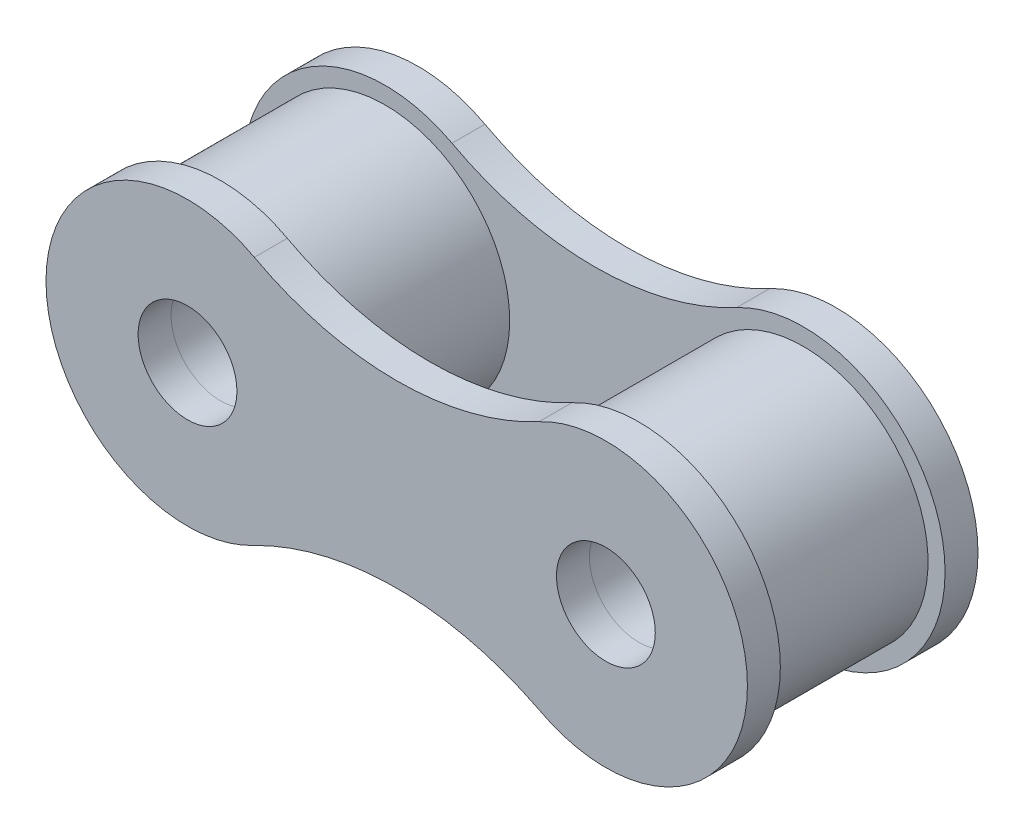
ISO-10303-21;
HEADER;
FILE_DESCRIPTION(('STEP AP214'),'2;1');
FILE_NAME('part.step','',(''),(''),'','','');
FILE_SCHEMA(('AUTOMOTIVE_DESIGN { 1 0 10303 214 1 1 1 1 }'));
ENDSEC;
DATA;
#1=APPLICATION_CONTEXT('core data for automotive mechanical design processes');
#2=APPLICATION_PROTOCOL_DEFINITION('international standard','automotive_design',2000,#1);
#3=PRODUCT_CONTEXT('',#1,'mechanical');
#4=PRODUCT('Part','Part','',(#3));
#5=PRODUCT_RELATED_PRODUCT_CATEGORY('part','',(#4));
#6=PRODUCT_DEFINITION_FORMATION('','',#4);
#7=PRODUCT_DEFINITION_CONTEXT('part definition',#1,'design');
#8=PRODUCT_DEFINITION('design','',#6,#7);
#9=PRODUCT_DEFINITION_SHAPE('','',#8);
#10=(LENGTH_UNIT() NAMED_UNIT(*) SI_UNIT(.MILLI.,.METRE.));
#11=(NAMED_UNIT(*) PLANE_ANGLE_UNIT() SI_UNIT($,.RADIAN.));
#12=(NAMED_UNIT(*) SI_UNIT($,.STERADIAN.) SOLID_ANGLE_UNIT());
#13=UNCERTAINTY_MEASURE_WITH_UNIT(LENGTH_MEASURE(1.E-05),#10,'distance_accuracy_value','');
#14=(GEOMETRIC_REPRESENTATION_CONTEXT(3) GLOBAL_UNCERTAINTY_ASSIGNED_CONTEXT((#13)) GLOBAL_UNIT_ASSIGNED_CONTEXT((#10,
#11,#12)) REPRESENTATION_CONTEXT('',''));
#15=CARTESIAN_POINT('',(0.,0.,0.));
#16=DIRECTION('',(0.,0.,1.));
#17=DIRECTION('',(1.,0.,0.));
#18=AXIS2_PLACEMENT_3D('',#15,#16,#17);
#19=CARTESIAN_POINT('',(3.175,5.92634311386175,-2.5));
#20=DIRECTION('',(0.,0.,1.));
#21=DIRECTION('',(1.,0.,0.));
#22=AXIS2_PLACEMENT_3D('',#19,#20,#21);
#23=PLANE('',#22);
#24=CARTESIAN_POINT('',(6.35,0.,-2.5));
#25=DIRECTION('',(0.,0.,1.));
#26=DIRECTION('',(1.,0.,0.));
#27=AXIS2_PLACEMENT_3D('',#24,#25,#26);
#28=CIRCLE('',#27,1.5);
#29=CARTESIAN_POINT('',(7.85,0.,-2.5));
#30=VERTEX_POINT('',#29);
#31=EDGE_CURVE('E170',#30,#30,#28,.T.);
#32=ORIENTED_EDGE('',*,*,#31,.F.);
#33=EDGE_LOOP('',(#32));
#34=FACE_BOUND('',#33,.T.);
#35=CARTESIAN_POINT('',(6.35,0.,-2.5));
#36=DIRECTION('',(0.,0.,1.));
#37=DIRECTION('',(1.,0.,0.));
#38=AXIS2_PLACEMENT_3D('',#35,#36,#37);
#39=CIRCLE('',#38,1.51190476190476);
#40=CARTESIAN_POINT('',(7.86190476190476,0.,-2.5));
#41=VERTEX_POINT('',#40);
#42=EDGE_CURVE('E11',#41,#41,#39,.F.);
#43=ORIENTED_EDGE('',*,*,#42,.F.);
#44=EDGE_LOOP('',(#43));
#45=FACE_BOUND('',#44,.T.);
#46=ADVANCED_FACE('F34',(#34,#45),#23,.T.);
#47=CARTESIAN_POINT('',(-6.35,0.,2.5));
#48=DIRECTION('',(0.,0.,-1.));
#49=DIRECTION('',(-1.,0.,0.));
#50=AXIS2_PLACEMENT_3D('',#47,#48,#49);
#51=CYLINDRICAL_SURFACE('',#50,3.77976190476191);
#52=CARTESIAN_POINT('',(-6.35,0.,2.5));
#53=DIRECTION('',(0.,0.,1.));
#54=DIRECTION('',(1.,0.,0.));
#55=AXIS2_PLACEMENT_3D('',#52,#53,#54);
#56=CIRCLE('',#55,3.77976190476191);
#57=CARTESIAN_POINT('',(-2.57023809523809,0.,2.5));
#58=VERTEX_POINT('',#57);
#59=EDGE_CURVE('E43',#58,#58,#56,.T.);
#60=ORIENTED_EDGE('',*,*,#59,.F.);
#61=EDGE_LOOP('',(#60));
#62=FACE_BOUND('',#61,.T.);
#63=CARTESIAN_POINT('',(-6.35,0.,-2.5));
#64=DIRECTION('',(0.,0.,1.));
#65=DIRECTION('',(1.,0.,0.));
#66=AXIS2_PLACEMENT_3D('',#63,#64,#65);
#67=CIRCLE('',#66,3.77976190476191);
#68=CARTESIAN_POINT('',(-2.57023809523809,0.,-2.5));
#69=VERTEX_POINT('',#68);
#70=EDGE_CURVE('E198',#69,#69,#67,.T.);
#71=ORIENTED_EDGE('',*,*,#70,.T.);
#72=EDGE_LOOP('',(#71));
#73=FACE_BOUND('',#72,.T.);
#74=ADVANCED_FACE('F36',(#62,#73),#51,.T.);
#75=CARTESIAN_POINT('',(-6.35,0.,2.5));
#76=DIRECTION('',(0.,0.,-1.));
#77=DIRECTION('',(-1.,0.,0.));
#78=AXIS2_PLACEMENT_3D('',#75,#76,#77);
#79=CYLINDRICAL_SURFACE('',#78,1.51190476190476);
#80=CARTESIAN_POINT('',(-6.35,0.,2.5));
#81=DIRECTION('',(0.,0.,1.));
#82=DIRECTION('',(1.,0.,0.));
#83=AXIS2_PLACEMENT_3D('',#80,#81,#82);
#84=CIRCLE('',#83,1.51190476190476);
#85=CARTESIAN_POINT('',(-4.83809523809524,0.,2.5));
#86=VERTEX_POINT('',#85);
#87=EDGE_CURVE('E159',#86,#86,#84,.T.);
#88=ORIENTED_EDGE('',*,*,#87,.T.);
#89=EDGE_LOOP('',(#88));
#90=FACE_BOUND('',#89,.T.);
#91=CARTESIAN_POINT('',(-6.35,0.,-2.5));
#92=DIRECTION('',(0.,0.,1.));
#93=DIRECTION('',(1.,0.,0.));
#94=AXIS2_PLACEMENT_3D('',#91,#92,#93);
#95=CIRCLE('',#94,1.51190476190476);
#96=CARTESIAN_POINT('',(-4.83809523809524,0.,-2.5));
#97=VERTEX_POINT('',#96);
#98=EDGE_CURVE('E205',#97,#97,#95,.T.);
#99=ORIENTED_EDGE('',*,*,#98,.F.);
#100=EDGE_LOOP('',(#99));
#101=FACE_BOUND('',#100,.T.);
#102=ADVANCED_FACE('F242',(#90,#101),#79,.F.);
#103=CARTESIAN_POINT('',(-6.35,0.,-2.5));
#104=DIRECTION('',(0.,0.,1.));
#105=DIRECTION('',(1.,0.,0.));
#106=AXIS2_PLACEMENT_3D('',#103,#104,#105);
#107=CIRCLE('',#106,1.5);
#108=CARTESIAN_POINT('',(-4.85,0.,-2.5));
#109=VERTEX_POINT('',#108);
#110=EDGE_CURVE('E163',#109,#109,#107,.T.);
#111=ORIENTED_EDGE('',*,*,#110,.F.);
#112=EDGE_LOOP('',(#111));
#113=FACE_BOUND('',#112,.T.);
#114=ORIENTED_EDGE('',*,*,#98,.T.);
#115=EDGE_LOOP('',(#114));
#116=FACE_BOUND('',#115,.T.);
#117=ADVANCED_FACE('F220',(#113,#116),#23,.T.);
#118=CARTESIAN_POINT('',(0.,11.8526862277235,-3.5));
#119=DIRECTION('',(0.,0.,1.));
#120=DIRECTION('',(1.,0.,0.));
#121=AXIS2_PLACEMENT_3D('',#118,#119,#120);
#122=CYLINDRICAL_SURFACE('',#121,9.15020153115917);
#123=CARTESIAN_POINT('',(0.,11.8526862277235,-2.5));
#124=DIRECTION('',(0.,0.,-1.));
#125=DIRECTION('',(1.,0.,0.));
#126=AXIS2_PLACEMENT_3D('',#123,#124,#125);
#127=CIRCLE('',#126,9.15020153115917);
#128=CARTESIAN_POINT('',(4.32110438729198,3.78706505295007,-2.5));
#129=VERTEX_POINT('',#128);
#130=CARTESIAN_POINT('',(-4.32110438729198,3.78706505295008,-2.5));
#131=VERTEX_POINT('',#130);
#132=EDGE_CURVE('E176',#129,#131,#127,.T.);
#133=ORIENTED_EDGE('',*,*,#132,.F.);
#134=DIRECTION('',(0.,0.,1.));
#135=VECTOR('',#134,1.);
#136=CARTESIAN_POINT('',(4.32110438729198,3.78706505295007,-3.5));
#137=LINE('',#136,#135);
#138=CARTESIAN_POINT('',(4.32110438729198,3.78706505295007,-3.5));
#139=VERTEX_POINT('',#138);
#140=EDGE_CURVE('E51',#139,#129,#137,.T.);
#141=ORIENTED_EDGE('',*,*,#140,.F.);
#142=CARTESIAN_POINT('',(0.,11.8526862277235,-3.5));
#143=DIRECTION('',(0.,0.,-1.));
#144=DIRECTION('',(1.,0.,0.));
#145=AXIS2_PLACEMENT_3D('',#142,#143,#144);
#146=CIRCLE('',#145,9.15020153115917);
#147=CARTESIAN_POINT('',(-4.32110438729198,3.78706505295008,-3.5));
#148=VERTEX_POINT('',#147);
#149=EDGE_CURVE('E179',#139,#148,#146,.T.);
#150=ORIENTED_EDGE('',*,*,#149,.T.);
#151=DIRECTION('',(0.,0.,1.));
#152=VECTOR('',#151,1.);
#153=CARTESIAN_POINT('',(-4.32110438729198,3.78706505295008,-3.5));
#154=LINE('',#153,#152);
#155=EDGE_CURVE('E80',#148,#131,#154,.T.);
#156=ORIENTED_EDGE('',*,*,#155,.T.);
#157=EDGE_LOOP('',(#133,#141,#150,#156));
#158=FACE_BOUND('',#157,.T.);
#159=ADVANCED_FACE('F221',(#158),#122,.F.);
#160=CARTESIAN_POINT('',(6.35,0.,-3.5));
#161=DIRECTION('',(0.,0.,1.));
#162=DIRECTION('',(1.,0.,0.));
#163=AXIS2_PLACEMENT_3D('',#160,#161,#162);
#164=CYLINDRICAL_SURFACE('',#163,4.2963099425602);
#165=CARTESIAN_POINT('',(6.35,0.,-2.5));
#166=DIRECTION('',(0.,0.,1.));
#167=DIRECTION('',(-1.,0.,0.));
#168=AXIS2_PLACEMENT_3D('',#165,#166,#167);
#169=CIRCLE('',#168,4.2963099425602);
#170=CARTESIAN_POINT('',(4.32110438729198,-3.78706505295008,-2.5));
#171=VERTEX_POINT('',#170);
#172=EDGE_CURVE('E182',#171,#129,#169,.T.);
#173=ORIENTED_EDGE('',*,*,#172,.F.);
#174=DIRECTION('',(0.,0.,1.));
#175=VECTOR('',#174,1.);
#176=CARTESIAN_POINT('',(4.32110438729198,-3.78706505295008,-3.5));
#177=LINE('',#176,#175);
#178=CARTESIAN_POINT('',(4.32110438729198,-3.78706505295008,-3.5));
#179=VERTEX_POINT('',#178);
#180=EDGE_CURVE('E69',#179,#171,#177,.T.);
#181=ORIENTED_EDGE('',*,*,#180,.F.);
#182=CARTESIAN_POINT('',(6.35,0.,-3.5));
#183=DIRECTION('',(0.,0.,1.));
#184=DIRECTION('',(-1.,0.,0.));
#185=AXIS2_PLACEMENT_3D('',#182,#183,#184);
#186=CIRCLE('',#185,4.2963099425602);
#187=EDGE_CURVE('E186',#179,#139,#186,.T.);
#188=ORIENTED_EDGE('',*,*,#187,.T.);
#189=ORIENTED_EDGE('',*,*,#140,.T.);
#190=EDGE_LOOP('',(#173,#181,#188,#189));
#191=FACE_BOUND('',#190,.T.);
#192=ADVANCED_FACE('F225',(#191),#164,.T.);
#193=CARTESIAN_POINT('',(0.,-12.2708333333333,-3.5));
#194=DIRECTION('',(0.,0.,1.));
#195=DIRECTION('',(1.,0.,0.));
#196=AXIS2_PLACEMENT_3D('',#193,#194,#195);
#197=CYLINDRICAL_SURFACE('',#196,9.52083333333333);
#198=CARTESIAN_POINT('',(0.,-12.2708333333333,-2.5));
#199=DIRECTION('',(0.,0.,-1.));
#200=DIRECTION('',(-1.,0.,0.));
#201=AXIS2_PLACEMENT_3D('',#198,#199,#200);
#202=CIRCLE('',#201,9.52083333333333);
#203=CARTESIAN_POINT('',(-4.32110438729198,-3.78706505295008,-2.5));
#204=VERTEX_POINT('',#203);
#205=EDGE_CURVE('E193',#204,#171,#202,.T.);
#206=ORIENTED_EDGE('',*,*,#205,.F.);
#207=DIRECTION('',(0.,0.,1.));
#208=VECTOR('',#207,1.);
#209=CARTESIAN_POINT('',(-4.32110438729198,-3.78706505295008,-3.5));
#210=LINE('',#209,#208);
#211=CARTESIAN_POINT('',(-4.32110438729198,-3.78706505295008,-3.5));
#212=VERTEX_POINT('',#211);
#213=EDGE_CURVE('E200',#212,#204,#210,.T.);
#214=ORIENTED_EDGE('',*,*,#213,.F.);
#215=CARTESIAN_POINT('',(0.,-12.2708333333333,-3.5));
#216=DIRECTION('',(0.,0.,-1.));
#217=DIRECTION('',(-1.,0.,0.));
#218=AXIS2_PLACEMENT_3D('',#215,#216,#217);
#219=CIRCLE('',#218,9.52083333333333);
#220=EDGE_CURVE('E184',#212,#179,#219,.T.);
#221=ORIENTED_EDGE('',*,*,#220,.T.);
#222=ORIENTED_EDGE('',*,*,#180,.T.);
#223=EDGE_LOOP('',(#206,#214,#221,#222));
#224=FACE_BOUND('',#223,.T.);
#225=ADVANCED_FACE('F224',(#224),#197,.F.);
#226=CARTESIAN_POINT('',(-6.35,0.,-3.5));
#227=DIRECTION('',(0.,0.,1.));
#228=DIRECTION('',(1.,0.,0.));
#229=AXIS2_PLACEMENT_3D('',#226,#227,#228);
#230=CYLINDRICAL_SURFACE('',#229,4.2963099425602);
#231=CARTESIAN_POINT('',(-6.35,0.,-2.5));
#232=DIRECTION('',(0.,0.,1.));
#233=DIRECTION('',(1.,0.,0.));
#234=AXIS2_PLACEMENT_3D('',#231,#232,#233);
#235=CIRCLE('',#234,4.2963099425602);
#236=EDGE_CURVE('E190',#131,#204,#235,.T.);
#237=ORIENTED_EDGE('',*,*,#236,.F.);
#238=ORIENTED_EDGE('',*,*,#155,.F.);
#239=CARTESIAN_POINT('',(-6.35,0.,-3.5));
#240=DIRECTION('',(0.,0.,1.));
#241=DIRECTION('',(1.,0.,0.));
#242=AXIS2_PLACEMENT_3D('',#239,#240,#241);
#243=CIRCLE('',#242,4.2963099425602);
#244=EDGE_CURVE('E181',#148,#212,#243,.T.);
#245=ORIENTED_EDGE('',*,*,#244,.T.);
#246=ORIENTED_EDGE('',*,*,#213,.T.);
#247=EDGE_LOOP('',(#237,#238,#245,#246));
#248=FACE_BOUND('',#247,.T.);
#249=ADVANCED_FACE('F222',(#248),#230,.T.);
#250=CARTESIAN_POINT('',(3.175,5.92634311386175,-3.5));
#251=DIRECTION('',(0.,0.,1.));
#252=DIRECTION('',(1.,0.,0.));
#253=AXIS2_PLACEMENT_3D('',#250,#251,#252);
#254=PLANE('',#253);
#255=CARTESIAN_POINT('',(-6.35,0.,-3.5));
#256=DIRECTION('',(0.,0.,1.));
#257=DIRECTION('',(1.,0.,0.));
#258=AXIS2_PLACEMENT_3D('',#255,#256,#257);
#259=CIRCLE('',#258,1.5);
#260=CARTESIAN_POINT('',(-4.85,0.,-3.5));
#261=VERTEX_POINT('',#260);
#262=EDGE_CURVE('E167',#261,#261,#259,.T.);
#263=ORIENTED_EDGE('',*,*,#262,.T.);
#264=EDGE_LOOP('',(#263));
#265=FACE_BOUND('',#264,.T.);
#266=CARTESIAN_POINT('',(6.35,0.,-3.5));
#267=DIRECTION('',(0.,0.,1.));
#268=DIRECTION('',(1.,0.,0.));
#269=AXIS2_PLACEMENT_3D('',#266,#267,#268);
#270=CIRCLE('',#269,1.5);
#271=CARTESIAN_POINT('',(7.85,0.,-3.5));
#272=VERTEX_POINT('',#271);
#273=EDGE_CURVE('E173',#272,#272,#270,.T.);
#274=ORIENTED_EDGE('',*,*,#273,.T.);
#275=EDGE_LOOP('',(#274));
#276=FACE_BOUND('',#275,.T.);
#277=ORIENTED_EDGE('',*,*,#149,.F.);
#278=ORIENTED_EDGE('',*,*,#187,.F.);
#279=ORIENTED_EDGE('',*,*,#220,.F.);
#280=ORIENTED_EDGE('',*,*,#244,.F.);
#281=EDGE_LOOP('',(#277,#278,#279,#280));
#282=FACE_BOUND('',#281,.T.);
#283=ADVANCED_FACE('F217',(#265,#276,#282),#254,.F.);
#284=CARTESIAN_POINT('',(6.35,0.,-2.5));
#285=DIRECTION('',(0.,0.,1.));
#286=DIRECTION('',(-1.,0.,0.));
#287=AXIS2_PLACEMENT_3D('',#284,#285,#286);
#288=CIRCLE('',#287,3.7797619047619);
#289=CARTESIAN_POINT('',(2.5702380952381,0.,-2.5));
#290=VERTEX_POINT('',#289);
#291=EDGE_CURVE('E164',#290,#290,#288,.T.);
#292=ORIENTED_EDGE('',*,*,#291,.F.);
#293=EDGE_LOOP('',(#292));
#294=FACE_BOUND('',#293,.T.);
#295=ORIENTED_EDGE('',*,*,#70,.F.);
#296=EDGE_LOOP('',(#295));
#297=FACE_BOUND('',#296,.T.);
#298=ORIENTED_EDGE('',*,*,#132,.T.);
#299=ORIENTED_EDGE('',*,*,#236,.T.);
#300=ORIENTED_EDGE('',*,*,#205,.T.);
#301=ORIENTED_EDGE('',*,*,#172,.T.);
#302=EDGE_LOOP('',(#298,#299,#300,#301));
#303=FACE_BOUND('',#302,.T.);
#304=ADVANCED_FACE('F213',(#294,#297,#303),#23,.T.);
#305=CARTESIAN_POINT('',(6.35,0.,-3.5));
#306=DIRECTION('',(0.,0.,1.));
#307=DIRECTION('',(1.,0.,0.));
#308=AXIS2_PLACEMENT_3D('',#305,#306,#307);
#309=CYLINDRICAL_SURFACE('',#308,1.5);
#310=ORIENTED_EDGE('',*,*,#273,.F.);
#311=EDGE_LOOP('',(#310));
#312=FACE_BOUND('',#311,.T.);
#313=ORIENTED_EDGE('',*,*,#31,.T.);
#314=EDGE_LOOP('',(#313));
#315=FACE_BOUND('',#314,.T.);
#316=ADVANCED_FACE('F216',(#312,#315),#309,.F.);
#317=CARTESIAN_POINT('',(-6.35,0.,-3.5));
#318=DIRECTION('',(0.,0.,1.));
#319=DIRECTION('',(1.,0.,0.));
#320=AXIS2_PLACEMENT_3D('',#317,#318,#319);
#321=CYLINDRICAL_SURFACE('',#320,1.5);
#322=ORIENTED_EDGE('',*,*,#262,.F.);
#323=EDGE_LOOP('',(#322));
#324=FACE_BOUND('',#323,.T.);
#325=ORIENTED_EDGE('',*,*,#110,.T.);
#326=EDGE_LOOP('',(#325));
#327=FACE_BOUND('',#326,.T.);
#328=ADVANCED_FACE('F260',(#324,#327),#321,.F.);
#329=CARTESIAN_POINT('',(6.35,0.,2.5));
#330=DIRECTION('',(0.,0.,-1.));
#331=DIRECTION('',(-1.,0.,0.));
#332=AXIS2_PLACEMENT_3D('',#329,#330,#331);
#333=CYLINDRICAL_SURFACE('',#332,3.7797619047619);
#334=CARTESIAN_POINT('',(6.35,0.,2.5));
#335=DIRECTION('',(0.,0.,1.));
#336=DIRECTION('',(-1.,0.,0.));
#337=AXIS2_PLACEMENT_3D('',#334,#335,#336);
#338=CIRCLE('',#337,3.7797619047619);
#339=CARTESIAN_POINT('',(2.5702380952381,0.,2.5));
#340=VERTEX_POINT('',#339);
#341=EDGE_CURVE('E160',#340,#340,#338,.T.);
#342=ORIENTED_EDGE('',*,*,#341,.F.);
#343=EDGE_LOOP('',(#342));
#344=FACE_BOUND('',#343,.T.);
#345=ORIENTED_EDGE('',*,*,#291,.T.);
#346=EDGE_LOOP('',(#345));
#347=FACE_BOUND('',#346,.T.);
#348=ADVANCED_FACE('F262',(#344,#347),#333,.T.);
#349=CARTESIAN_POINT('',(6.35,0.,2.5));
#350=DIRECTION('',(0.,0.,-1.));
#351=DIRECTION('',(-1.,0.,0.));
#352=AXIS2_PLACEMENT_3D('',#349,#350,#351);
#353=CYLINDRICAL_SURFACE('',#352,1.51190476190476);
#354=CARTESIAN_POINT('',(6.35,0.,2.5));
#355=DIRECTION('',(0.,0.,1.));
#356=DIRECTION('',(-1.,0.,0.));
#357=AXIS2_PLACEMENT_3D('',#354,#355,#356);
#358=CIRCLE('',#357,1.51190476190476);
#359=CARTESIAN_POINT('',(4.83809523809524,0.,2.5));
#360=VERTEX_POINT('',#359);
#361=EDGE_CURVE('E152',#360,#360,#358,.T.);
#362=ORIENTED_EDGE('',*,*,#361,.T.);
#363=EDGE_LOOP('',(#362));
#364=FACE_BOUND('',#363,.T.);
#365=ORIENTED_EDGE('',*,*,#42,.T.);
#366=EDGE_LOOP('',(#365));
#367=FACE_BOUND('',#366,.T.);
#368=ADVANCED_FACE('F269',(#364,#367),#353,.F.);
#369=CARTESIAN_POINT('',(3.175,5.92634311386175,2.5));
#370=DIRECTION('',(0.,0.,-1.));
#371=DIRECTION('',(1.,0.,0.));
#372=AXIS2_PLACEMENT_3D('',#369,#370,#371);
#373=PLANE('',#372);
#374=CARTESIAN_POINT('',(-6.35,0.,2.5));
#375=DIRECTION('',(0.,0.,1.));
#376=DIRECTION('',(1.,0.,0.));
#377=AXIS2_PLACEMENT_3D('',#374,#375,#376);
#378=CIRCLE('',#377,1.5);
#379=CARTESIAN_POINT('',(-4.85,0.,2.5));
#380=VERTEX_POINT('',#379);
#381=EDGE_CURVE('E313',#380,#380,#378,.T.);
#382=ORIENTED_EDGE('',*,*,#381,.T.);
#383=EDGE_LOOP('',(#382));
#384=FACE_BOUND('',#383,.T.);
#385=ORIENTED_EDGE('',*,*,#87,.F.);
#386=EDGE_LOOP('',(#385));
#387=FACE_BOUND('',#386,.T.);
#388=ADVANCED_FACE('F277',(#384,#387),#373,.T.);
#389=CARTESIAN_POINT('',(6.35,0.,2.5));
#390=DIRECTION('',(0.,0.,1.));
#391=DIRECTION('',(1.,0.,0.));
#392=AXIS2_PLACEMENT_3D('',#389,#390,#391);
#393=CIRCLE('',#392,1.5);
#394=CARTESIAN_POINT('',(7.85,0.,2.5));
#395=VERTEX_POINT('',#394);
#396=EDGE_CURVE('E141',#395,#395,#393,.T.);
#397=ORIENTED_EDGE('',*,*,#396,.T.);
#398=EDGE_LOOP('',(#397));
#399=FACE_BOUND('',#398,.T.);
#400=ORIENTED_EDGE('',*,*,#361,.F.);
#401=EDGE_LOOP('',(#400));
#402=FACE_BOUND('',#401,.T.);
#403=ADVANCED_FACE('F296',(#399,#402),#373,.T.);
#404=CARTESIAN_POINT('',(3.175,5.92634311386175,3.5));
#405=DIRECTION('',(0.,0.,-1.));
#406=DIRECTION('',(1.,0.,0.));
#407=AXIS2_PLACEMENT_3D('',#404,#405,#406);
#408=PLANE('',#407);
#409=CARTESIAN_POINT('',(0.,11.8526862277235,3.5));
#410=DIRECTION('',(0.,0.,-1.));
#411=DIRECTION('',(1.,0.,0.));
#412=AXIS2_PLACEMENT_3D('',#409,#410,#411);
#413=CIRCLE('',#412,9.15020153115917);
#414=CARTESIAN_POINT('',(4.32110438729198,3.78706505295007,3.5));
#415=VERTEX_POINT('',#414);
#416=CARTESIAN_POINT('',(-4.32110438729198,3.78706505295008,3.5));
#417=VERTEX_POINT('',#416);
#418=EDGE_CURVE('E114',#415,#417,#413,.T.);
#419=ORIENTED_EDGE('',*,*,#418,.T.);
#420=CARTESIAN_POINT('',(-6.35,0.,3.5));
#421=DIRECTION('',(0.,0.,1.));
#422=DIRECTION('',(1.,0.,0.));
#423=AXIS2_PLACEMENT_3D('',#420,#421,#422);
#424=CIRCLE('',#423,4.2963099425602);
#425=CARTESIAN_POINT('',(-4.32110438729198,-3.78706505295008,3.5));
#426=VERTEX_POINT('',#425);
#427=EDGE_CURVE('E131',#417,#426,#424,.T.);
#428=ORIENTED_EDGE('',*,*,#427,.T.);
#429=CARTESIAN_POINT('',(0.,-12.2708333333333,3.5));
#430=DIRECTION('',(0.,0.,-1.));
#431=DIRECTION('',(-1.,0.,0.));
#432=AXIS2_PLACEMENT_3D('',#429,#430,#431);
#433=CIRCLE('',#432,9.52083333333333);
#434=CARTESIAN_POINT('',(4.32110438729198,-3.78706505295008,3.5));
#435=VERTEX_POINT('',#434);
#436=EDGE_CURVE('E117',#426,#435,#433,.T.);
#437=ORIENTED_EDGE('',*,*,#436,.T.);
#438=CARTESIAN_POINT('',(6.35,0.,3.5));
#439=DIRECTION('',(0.,0.,1.));
#440=DIRECTION('',(-1.,0.,0.));
#441=AXIS2_PLACEMENT_3D('',#438,#439,#440);
#442=CIRCLE('',#441,4.2963099425602);
#443=EDGE_CURVE('E109',#435,#415,#442,.T.);
#444=ORIENTED_EDGE('',*,*,#443,.T.);
#445=EDGE_LOOP('',(#419,#428,#437,#444));
#446=FACE_BOUND('',#445,.T.);
#447=CARTESIAN_POINT('',(6.35,0.,3.5));
#448=DIRECTION('',(0.,0.,1.));
#449=DIRECTION('',(1.,0.,0.));
#450=AXIS2_PLACEMENT_3D('',#447,#448,#449);
#451=CIRCLE('',#450,1.5);
#452=CARTESIAN_POINT('',(7.85,0.,3.5));
#453=VERTEX_POINT('',#452);
#454=EDGE_CURVE('E148',#453,#453,#451,.T.);
#455=ORIENTED_EDGE('',*,*,#454,.F.);
#456=EDGE_LOOP('',(#455));
#457=FACE_BOUND('',#456,.T.);
#458=CARTESIAN_POINT('',(-6.35,0.,3.5));
#459=DIRECTION('',(0.,0.,1.));
#460=DIRECTION('',(1.,0.,0.));
#461=AXIS2_PLACEMENT_3D('',#458,#459,#460);
#462=CIRCLE('',#461,1.5);
#463=CARTESIAN_POINT('',(-4.85,0.,3.5));
#464=VERTEX_POINT('',#463);
#465=EDGE_CURVE('E310',#464,#464,#462,.T.);
#466=ORIENTED_EDGE('',*,*,#465,.F.);
#467=EDGE_LOOP('',(#466));
#468=FACE_BOUND('',#467,.T.);
#469=ADVANCED_FACE('F111',(#446,#457,#468),#408,.F.);
#470=ORIENTED_EDGE('',*,*,#59,.T.);
#471=EDGE_LOOP('',(#470));
#472=FACE_BOUND('',#471,.T.);
#473=ORIENTED_EDGE('',*,*,#341,.T.);
#474=EDGE_LOOP('',(#473));
#475=FACE_BOUND('',#474,.T.);
#476=CARTESIAN_POINT('',(0.,11.8526862277235,2.5));
#477=DIRECTION('',(0.,0.,-1.));
#478=DIRECTION('',(1.,0.,0.));
#479=AXIS2_PLACEMENT_3D('',#476,#477,#478);
#480=CIRCLE('',#479,9.15020153115917);
#481=CARTESIAN_POINT('',(4.32110438729198,3.78706505295007,2.5));
#482=VERTEX_POINT('',#481);
#483=CARTESIAN_POINT('',(-4.32110438729198,3.78706505295008,2.5));
#484=VERTEX_POINT('',#483);
#485=EDGE_CURVE('E146',#482,#484,#480,.T.);
#486=ORIENTED_EDGE('',*,*,#485,.F.);
#487=CARTESIAN_POINT('',(6.35,0.,2.5));
#488=DIRECTION('',(0.,0.,1.));
#489=DIRECTION('',(-1.,0.,0.));
#490=AXIS2_PLACEMENT_3D('',#487,#488,#489);
#491=CIRCLE('',#490,4.2963099425602);
#492=CARTESIAN_POINT('',(4.32110438729198,-3.78706505295008,2.5));
#493=VERTEX_POINT('',#492);
#494=EDGE_CURVE('E126',#493,#482,#491,.T.);
#495=ORIENTED_EDGE('',*,*,#494,.F.);
#496=CARTESIAN_POINT('',(0.,-12.2708333333333,2.5));
#497=DIRECTION('',(0.,0.,-1.));
#498=DIRECTION('',(-1.,0.,0.));
#499=AXIS2_PLACEMENT_3D('',#496,#497,#498);
#500=CIRCLE('',#499,9.52083333333333);
#501=CARTESIAN_POINT('',(-4.32110438729198,-3.78706505295008,2.5));
#502=VERTEX_POINT('',#501);
#503=EDGE_CURVE('E138',#502,#493,#500,.T.);
#504=ORIENTED_EDGE('',*,*,#503,.F.);
#505=CARTESIAN_POINT('',(-6.35,0.,2.5));
#506=DIRECTION('',(0.,0.,1.));
#507=DIRECTION('',(1.,0.,0.));
#508=AXIS2_PLACEMENT_3D('',#505,#506,#507);
#509=CIRCLE('',#508,4.2963099425602);
#510=EDGE_CURVE('E136',#484,#502,#509,.T.);
#511=ORIENTED_EDGE('',*,*,#510,.F.);
#512=EDGE_LOOP('',(#486,#495,#504,#511));
#513=FACE_BOUND('',#512,.T.);
#514=ADVANCED_FACE('F282',(#472,#475,#513),#373,.T.);
#515=CARTESIAN_POINT('',(0.,11.8526862277235,3.5));
#516=DIRECTION('',(0.,0.,-1.));
#517=DIRECTION('',(-1.,0.,0.));
#518=AXIS2_PLACEMENT_3D('',#515,#516,#517);
#519=CYLINDRICAL_SURFACE('',#518,9.15020153115917);
#520=ORIENTED_EDGE('',*,*,#485,.T.);
#521=DIRECTION('',(0.,0.,-1.));
#522=VECTOR('',#521,1.);
#523=CARTESIAN_POINT('',(-4.32110438729198,3.78706505295008,3.5));
#524=LINE('',#523,#522);
#525=EDGE_CURVE('E135',#417,#484,#524,.T.);
#526=ORIENTED_EDGE('',*,*,#525,.F.);
#527=ORIENTED_EDGE('',*,*,#418,.F.);
#528=DIRECTION('',(0.,0.,-1.));
#529=VECTOR('',#528,1.);
#530=CARTESIAN_POINT('',(4.32110438729198,3.78706505295007,3.5));
#531=LINE('',#530,#529);
#532=EDGE_CURVE('E123',#415,#482,#531,.T.);
#533=ORIENTED_EDGE('',*,*,#532,.T.);
#534=EDGE_LOOP('',(#520,#526,#527,#533));
#535=FACE_BOUND('',#534,.T.);
#536=ADVANCED_FACE('F133',(#535),#519,.F.);
#537=CARTESIAN_POINT('',(-6.35,0.,3.5));
#538=DIRECTION('',(0.,0.,-1.));
#539=DIRECTION('',(-1.,0.,0.));
#540=AXIS2_PLACEMENT_3D('',#537,#538,#539);
#541=CYLINDRICAL_SURFACE('',#540,4.2963099425602);
#542=ORIENTED_EDGE('',*,*,#510,.T.);
#543=DIRECTION('',(0.,0.,-1.));
#544=VECTOR('',#543,1.);
#545=CARTESIAN_POINT('',(-4.32110438729198,-3.78706505295008,3.5));
#546=LINE('',#545,#544);
#547=EDGE_CURVE('E153',#426,#502,#546,.T.);
#548=ORIENTED_EDGE('',*,*,#547,.F.);
#549=ORIENTED_EDGE('',*,*,#427,.F.);
#550=ORIENTED_EDGE('',*,*,#525,.T.);
#551=EDGE_LOOP('',(#542,#548,#549,#550));
#552=FACE_BOUND('',#551,.T.);
#553=ADVANCED_FACE('F281',(#552),#541,.T.);
#554=CARTESIAN_POINT('',(0.,-12.2708333333333,3.5));
#555=DIRECTION('',(0.,0.,-1.));
#556=DIRECTION('',(-1.,0.,0.));
#557=AXIS2_PLACEMENT_3D('',#554,#555,#556);
#558=CYLINDRICAL_SURFACE('',#557,9.52083333333333);
#559=ORIENTED_EDGE('',*,*,#503,.T.);
#560=DIRECTION('',(0.,0.,-1.));
#561=VECTOR('',#560,1.);
#562=CARTESIAN_POINT('',(4.32110438729198,-3.78706505295008,3.5));
#563=LINE('',#562,#561);
#564=EDGE_CURVE('E130',#435,#493,#563,.T.);
#565=ORIENTED_EDGE('',*,*,#564,.F.);
#566=ORIENTED_EDGE('',*,*,#436,.F.);
#567=ORIENTED_EDGE('',*,*,#547,.T.);
#568=EDGE_LOOP('',(#559,#565,#566,#567));
#569=FACE_BOUND('',#568,.T.);
#570=ADVANCED_FACE('F286',(#569),#558,.F.);
#571=CARTESIAN_POINT('',(6.35,0.,3.5));
#572=DIRECTION('',(0.,0.,-1.));
#573=DIRECTION('',(-1.,0.,0.));
#574=AXIS2_PLACEMENT_3D('',#571,#572,#573);
#575=CYLINDRICAL_SURFACE('',#574,4.2963099425602);
#576=ORIENTED_EDGE('',*,*,#494,.T.);
#577=ORIENTED_EDGE('',*,*,#532,.F.);
#578=ORIENTED_EDGE('',*,*,#443,.F.);
#579=ORIENTED_EDGE('',*,*,#564,.T.);
#580=EDGE_LOOP('',(#576,#577,#578,#579));
#581=FACE_BOUND('',#580,.T.);
#582=ADVANCED_FACE('F124',(#581),#575,.T.);
#583=CARTESIAN_POINT('',(6.35,0.,3.5));
#584=DIRECTION('',(0.,0.,-1.));
#585=DIRECTION('',(-1.,0.,0.));
#586=AXIS2_PLACEMENT_3D('',#583,#584,#585);
#587=CYLINDRICAL_SURFACE('',#586,1.5);
#588=ORIENTED_EDGE('',*,*,#454,.T.);
#589=EDGE_LOOP('',(#588));
#590=FACE_BOUND('',#589,.T.);
#591=ORIENTED_EDGE('',*,*,#396,.F.);
#592=EDGE_LOOP('',(#591));
#593=FACE_BOUND('',#592,.T.);
#594=ADVANCED_FACE('F285',(#590,#593),#587,.F.);
#595=CARTESIAN_POINT('',(-6.35,0.,3.5));
#596=DIRECTION('',(0.,0.,-1.));
#597=DIRECTION('',(-1.,0.,0.));
#598=AXIS2_PLACEMENT_3D('',#595,#596,#597);
#599=CYLINDRICAL_SURFACE('',#598,1.5);
#600=ORIENTED_EDGE('',*,*,#465,.T.);
#601=EDGE_LOOP('',(#600));
#602=FACE_BOUND('',#601,.T.);
#603=ORIENTED_EDGE('',*,*,#381,.F.);
#604=EDGE_LOOP('',(#603));
#605=FACE_BOUND('',#604,.T.);
#606=ADVANCED_FACE('F301',(#602,#605),#599,.F.);
#607=CLOSED_SHELL('',(#46,#74,#102,#117,#159,#192,#225,#249,#283,#304,#316,#328,#348,#368,#388,
#403,#469,#514,#536,#553,#570,#582,#594,#606));
#608=MANIFOLD_SOLID_BREP('B2',#607);
#609=ADVANCED_BREP_SHAPE_REPRESENTATION('',(#18,#608),#14);
#610=SHAPE_DEFINITION_REPRESENTATION(#9,#609);
ENDSEC;
END-ISO-10303-21;
